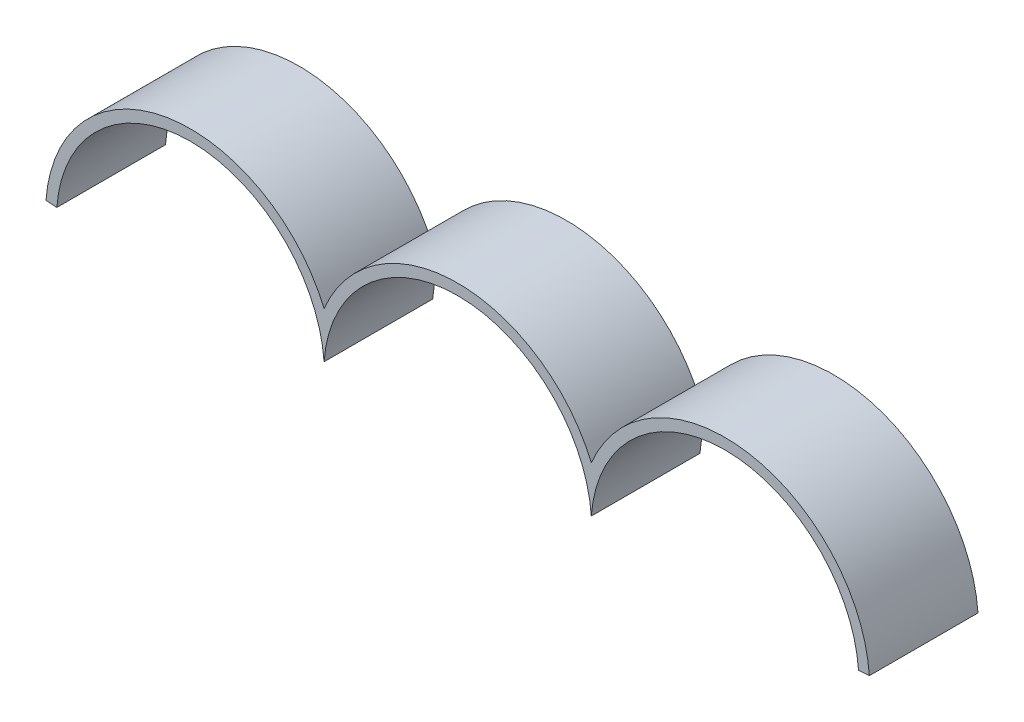
ISO-10303-21;
HEADER;
FILE_DESCRIPTION(('STEP AP214'),'2;1');
FILE_NAME('part.step','',(''),(''),'','','');
FILE_SCHEMA(('AUTOMOTIVE_DESIGN { 1 0 10303 214 1 1 1 1 }'));
ENDSEC;
DATA;
#1=APPLICATION_CONTEXT('core data for automotive mechanical design processes');
#2=APPLICATION_PROTOCOL_DEFINITION('international standard','automotive_design',2000,#1);
#3=PRODUCT_CONTEXT('',#1,'mechanical');
#4=PRODUCT('Part','Part','',(#3));
#5=PRODUCT_RELATED_PRODUCT_CATEGORY('part','',(#4));
#6=PRODUCT_DEFINITION_FORMATION('','',#4);
#7=PRODUCT_DEFINITION_CONTEXT('part definition',#1,'design');
#8=PRODUCT_DEFINITION('design','',#6,#7);
#9=PRODUCT_DEFINITION_SHAPE('','',#8);
#10=(LENGTH_UNIT() NAMED_UNIT(*) SI_UNIT(.MILLI.,.METRE.));
#11=(NAMED_UNIT(*) PLANE_ANGLE_UNIT() SI_UNIT($,.RADIAN.));
#12=(NAMED_UNIT(*) SI_UNIT($,.STERADIAN.) SOLID_ANGLE_UNIT());
#13=UNCERTAINTY_MEASURE_WITH_UNIT(LENGTH_MEASURE(1.E-05),#10,'distance_accuracy_value','');
#14=(GEOMETRIC_REPRESENTATION_CONTEXT(3) GLOBAL_UNCERTAINTY_ASSIGNED_CONTEXT((#13)) GLOBAL_UNIT_ASSIGNED_CONTEXT((#10,
#11,#12)) REPRESENTATION_CONTEXT('',''));
#15=CARTESIAN_POINT('',(0.,0.,0.));
#16=DIRECTION('',(0.,0.,1.));
#17=DIRECTION('',(1.,0.,0.));
#18=AXIS2_PLACEMENT_3D('',#15,#16,#17);
#19=CARTESIAN_POINT('',(-36.8997698041831,-2.72157829178189,30.));
#20=DIRECTION('',(0.,0.,-1.));
#21=DIRECTION('',(-1.,0.,0.));
#22=AXIS2_PLACEMENT_3D('',#19,#20,#21);
#23=CYLINDRICAL_SURFACE('',#22,37.);
#24=CARTESIAN_POINT('',(-36.8997698041831,-2.72157829178189,0.));
#25=DIRECTION('',(0.,0.,-1.));
#26=DIRECTION('',(1.,0.,0.));
#27=AXIS2_PLACEMENT_3D('',#24,#25,#26);
#28=CIRCLE('',#27,37.);
#29=CARTESIAN_POINT('',(-73.7995396083662,0.,0.));
#30=VERTEX_POINT('',#29);
#31=CARTESIAN_POINT('',(0.,0.,0.));
#32=VERTEX_POINT('',#31);
#33=EDGE_CURVE('E128',#30,#32,#28,.T.);
#34=ORIENTED_EDGE('',*,*,#33,.T.);
#35=DIRECTION('',(0.,0.,-1.));
#36=VECTOR('',#35,1.);
#37=CARTESIAN_POINT('',(0.,0.,30.));
#38=LINE('',#37,#36);
#39=CARTESIAN_POINT('',(0.,0.,30.));
#40=VERTEX_POINT('',#39);
#41=EDGE_CURVE('E11',#40,#32,#38,.T.);
#42=ORIENTED_EDGE('',*,*,#41,.F.);
#43=CARTESIAN_POINT('',(-36.8997698041831,-2.72157829178189,30.));
#44=DIRECTION('',(0.,0.,-1.));
#45=DIRECTION('',(1.,0.,0.));
#46=AXIS2_PLACEMENT_3D('',#43,#44,#45);
#47=CIRCLE('',#46,37.);
#48=CARTESIAN_POINT('',(-73.7995396083662,0.,30.));
#49=VERTEX_POINT('',#48);
#50=EDGE_CURVE('E142',#49,#40,#47,.T.);
#51=ORIENTED_EDGE('',*,*,#50,.F.);
#52=DIRECTION('',(0.,0.,-1.));
#53=VECTOR('',#52,1.);
#54=CARTESIAN_POINT('',(-73.7995396083662,0.,30.));
#55=LINE('',#54,#53);
#56=EDGE_CURVE('E124',#49,#30,#55,.T.);
#57=ORIENTED_EDGE('',*,*,#56,.T.);
#58=EDGE_LOOP('',(#34,#42,#51,#57));
#59=FACE_BOUND('',#58,.T.);
#60=ADVANCED_FACE('F32',(#59),#23,.F.);
#61=CARTESIAN_POINT('',(36.8997698041831,-2.72157829178189,30.));
#62=DIRECTION('',(0.,0.,-1.));
#63=DIRECTION('',(-1.,0.,0.));
#64=AXIS2_PLACEMENT_3D('',#61,#62,#63);
#65=CYLINDRICAL_SURFACE('',#64,37.);
#66=CARTESIAN_POINT('',(36.8997698041831,-2.72157829178189,0.));
#67=DIRECTION('',(0.,0.,-1.));
#68=DIRECTION('',(-1.,0.,0.));
#69=AXIS2_PLACEMENT_3D('',#66,#67,#68);
#70=CIRCLE('',#69,37.);
#71=CARTESIAN_POINT('',(73.7995396083662,0.,0.));
#72=VERTEX_POINT('',#71);
#73=EDGE_CURVE('E131',#32,#72,#70,.T.);
#74=ORIENTED_EDGE('',*,*,#73,.T.);
#75=DIRECTION('',(0.,0.,-1.));
#76=VECTOR('',#75,1.);
#77=CARTESIAN_POINT('',(73.7995396083662,0.,30.));
#78=LINE('',#77,#76);
#79=CARTESIAN_POINT('',(73.7995396083662,0.,30.));
#80=VERTEX_POINT('',#79);
#81=EDGE_CURVE('E40',#80,#72,#78,.T.);
#82=ORIENTED_EDGE('',*,*,#81,.F.);
#83=CARTESIAN_POINT('',(36.8997698041831,-2.72157829178189,30.));
#84=DIRECTION('',(0.,0.,-1.));
#85=DIRECTION('',(-1.,0.,0.));
#86=AXIS2_PLACEMENT_3D('',#83,#84,#85);
#87=CIRCLE('',#86,37.);
#88=EDGE_CURVE('E91',#40,#80,#87,.T.);
#89=ORIENTED_EDGE('',*,*,#88,.F.);
#90=ORIENTED_EDGE('',*,*,#41,.T.);
#91=EDGE_LOOP('',(#74,#82,#89,#90));
#92=FACE_BOUND('',#91,.T.);
#93=ADVANCED_FACE('F177',(#92),#65,.F.);
#94=CARTESIAN_POINT('',(110.699309412549,-2.72157829178189,30.));
#95=DIRECTION('',(0.,0.,-1.));
#96=DIRECTION('',(-1.,0.,0.));
#97=AXIS2_PLACEMENT_3D('',#94,#95,#96);
#98=CYLINDRICAL_SURFACE('',#97,37.);
#99=CARTESIAN_POINT('',(110.699309412549,-2.72157829178189,0.));
#100=DIRECTION('',(0.,0.,-1.));
#101=DIRECTION('',(-1.,0.,0.));
#102=AXIS2_PLACEMENT_3D('',#99,#100,#101);
#103=CIRCLE('',#102,37.);
#104=CARTESIAN_POINT('',(147.599079216732,0.,0.));
#105=VERTEX_POINT('',#104);
#106=EDGE_CURVE('E133',#72,#105,#103,.T.);
#107=ORIENTED_EDGE('',*,*,#106,.T.);
#108=DIRECTION('',(0.,0.,-1.));
#109=VECTOR('',#108,1.);
#110=CARTESIAN_POINT('',(147.599079216732,0.,30.));
#111=LINE('',#110,#109);
#112=CARTESIAN_POINT('',(147.599079216732,0.,30.));
#113=VERTEX_POINT('',#112);
#114=EDGE_CURVE('E149',#113,#105,#111,.T.);
#115=ORIENTED_EDGE('',*,*,#114,.F.);
#116=CARTESIAN_POINT('',(110.699309412549,-2.72157829178189,30.));
#117=DIRECTION('',(0.,0.,-1.));
#118=DIRECTION('',(-1.,0.,0.));
#119=AXIS2_PLACEMENT_3D('',#116,#117,#118);
#120=CIRCLE('',#119,37.);
#121=EDGE_CURVE('E157',#80,#113,#120,.T.);
#122=ORIENTED_EDGE('',*,*,#121,.F.);
#123=ORIENTED_EDGE('',*,*,#81,.T.);
#124=EDGE_LOOP('',(#107,#115,#122,#123));
#125=FACE_BOUND('',#124,.T.);
#126=ADVANCED_FACE('F155',(#125),#98,.F.);
#127=CARTESIAN_POINT('',(150.590952444099,0.220668510144477,30.));
#128=DIRECTION('',(-0.0735561700481586,0.997291075788732,0.));
#129=DIRECTION('',(-0.997291075788732,-0.0735561700481586,0.));
#130=AXIS2_PLACEMENT_3D('',#127,#128,#129);
#131=PLANE('',#130);
#132=DIRECTION('',(0.997291075788732,0.0735561700481586,0.));
#133=VECTOR('',#132,1.);
#134=CARTESIAN_POINT('',(150.590952444099,0.220668510144477,0.));
#135=LINE('',#134,#133);
#136=CARTESIAN_POINT('',(150.590952444099,0.220668510144477,0.));
#137=VERTEX_POINT('',#136);
#138=EDGE_CURVE('E135',#105,#137,#135,.T.);
#139=ORIENTED_EDGE('',*,*,#138,.T.);
#140=DIRECTION('',(0.,0.,-1.));
#141=VECTOR('',#140,1.);
#142=CARTESIAN_POINT('',(150.590952444099,0.220668510144477,30.));
#143=LINE('',#142,#141);
#144=CARTESIAN_POINT('',(150.590952444099,0.220668510144477,30.));
#145=VERTEX_POINT('',#144);
#146=EDGE_CURVE('E146',#145,#137,#143,.T.);
#147=ORIENTED_EDGE('',*,*,#146,.F.);
#148=DIRECTION('',(0.997291075788732,0.0735561700481586,0.));
#149=VECTOR('',#148,1.);
#150=CARTESIAN_POINT('',(150.590952444099,0.220668510144477,30.));
#151=LINE('',#150,#149);
#152=EDGE_CURVE('E169',#113,#145,#151,.T.);
#153=ORIENTED_EDGE('',*,*,#152,.F.);
#154=ORIENTED_EDGE('',*,*,#114,.T.);
#155=EDGE_LOOP('',(#139,#147,#153,#154));
#156=FACE_BOUND('',#155,.T.);
#157=ADVANCED_FACE('F165',(#156),#131,.F.);
#158=CARTESIAN_POINT('',(110.699309412549,-2.72157829178189,30.));
#159=DIRECTION('',(0.,0.,-1.));
#160=DIRECTION('',(-1.,0.,0.));
#161=AXIS2_PLACEMENT_3D('',#158,#159,#160);
#162=CYLINDRICAL_SURFACE('',#161,40.);
#163=CARTESIAN_POINT('',(110.699309412549,-2.72157829178189,0.));
#164=DIRECTION('',(0.,0.,1.));
#165=DIRECTION('',(-1.,0.,0.));
#166=AXIS2_PLACEMENT_3D('',#163,#164,#165);
#167=CIRCLE('',#166,40.);
#168=CARTESIAN_POINT('',(73.7995396083662,12.718855264252,0.));
#169=VERTEX_POINT('',#168);
#170=EDGE_CURVE('E137',#137,#169,#167,.T.);
#171=ORIENTED_EDGE('',*,*,#170,.T.);
#172=DIRECTION('',(0.,0.,-1.));
#173=VECTOR('',#172,1.);
#174=CARTESIAN_POINT('',(73.7995396083662,12.718855264252,30.));
#175=LINE('',#174,#173);
#176=CARTESIAN_POINT('',(73.7995396083662,12.718855264252,30.));
#177=VERTEX_POINT('',#176);
#178=EDGE_CURVE('E119',#177,#169,#175,.T.);
#179=ORIENTED_EDGE('',*,*,#178,.F.);
#180=CARTESIAN_POINT('',(110.699309412549,-2.72157829178189,30.));
#181=DIRECTION('',(0.,0.,1.));
#182=DIRECTION('',(-1.,0.,0.));
#183=AXIS2_PLACEMENT_3D('',#180,#181,#182);
#184=CIRCLE('',#183,40.);
#185=EDGE_CURVE('E110',#145,#177,#184,.T.);
#186=ORIENTED_EDGE('',*,*,#185,.F.);
#187=ORIENTED_EDGE('',*,*,#146,.T.);
#188=EDGE_LOOP('',(#171,#179,#186,#187));
#189=FACE_BOUND('',#188,.T.);
#190=ADVANCED_FACE('F168',(#189),#162,.T.);
#191=CARTESIAN_POINT('',(36.8997698041831,-2.72157829178189,30.));
#192=DIRECTION('',(0.,0.,-1.));
#193=DIRECTION('',(-1.,0.,0.));
#194=AXIS2_PLACEMENT_3D('',#191,#192,#193);
#195=CYLINDRICAL_SURFACE('',#194,40.);
#196=CARTESIAN_POINT('',(36.8997698041831,-2.72157829178189,0.));
#197=DIRECTION('',(0.,0.,1.));
#198=DIRECTION('',(-1.,0.,0.));
#199=AXIS2_PLACEMENT_3D('',#196,#197,#198);
#200=CIRCLE('',#199,40.);
#201=CARTESIAN_POINT('',(0.,12.718855264252,0.));
#202=VERTEX_POINT('',#201);
#203=EDGE_CURVE('E118',#169,#202,#200,.T.);
#204=ORIENTED_EDGE('',*,*,#203,.T.);
#205=DIRECTION('',(0.,0.,-1.));
#206=VECTOR('',#205,1.);
#207=CARTESIAN_POINT('',(0.,12.718855264252,30.));
#208=LINE('',#207,#206);
#209=CARTESIAN_POINT('',(0.,12.718855264252,30.));
#210=VERTEX_POINT('',#209);
#211=EDGE_CURVE('E115',#210,#202,#208,.T.);
#212=ORIENTED_EDGE('',*,*,#211,.F.);
#213=CARTESIAN_POINT('',(36.8997698041831,-2.72157829178189,30.));
#214=DIRECTION('',(0.,0.,1.));
#215=DIRECTION('',(-1.,0.,0.));
#216=AXIS2_PLACEMENT_3D('',#213,#214,#215);
#217=CIRCLE('',#216,40.);
#218=EDGE_CURVE('E104',#177,#210,#217,.T.);
#219=ORIENTED_EDGE('',*,*,#218,.F.);
#220=ORIENTED_EDGE('',*,*,#178,.T.);
#221=EDGE_LOOP('',(#204,#212,#219,#220));
#222=FACE_BOUND('',#221,.T.);
#223=ADVANCED_FACE('F116',(#222),#195,.T.);
#224=CARTESIAN_POINT('',(-36.8997698041831,-2.72157829178189,30.));
#225=DIRECTION('',(0.,0.,-1.));
#226=DIRECTION('',(-1.,0.,0.));
#227=AXIS2_PLACEMENT_3D('',#224,#225,#226);
#228=CYLINDRICAL_SURFACE('',#227,40.);
#229=CARTESIAN_POINT('',(-36.8997698041831,-2.72157829178189,0.));
#230=DIRECTION('',(0.,0.,1.));
#231=DIRECTION('',(1.,0.,0.));
#232=AXIS2_PLACEMENT_3D('',#229,#230,#231);
#233=CIRCLE('',#232,40.);
#234=CARTESIAN_POINT('',(-76.7914128357324,0.220668510144472,0.));
#235=VERTEX_POINT('',#234);
#236=EDGE_CURVE('E77',#202,#235,#233,.T.);
#237=ORIENTED_EDGE('',*,*,#236,.T.);
#238=DIRECTION('',(0.,0.,-1.));
#239=VECTOR('',#238,1.);
#240=CARTESIAN_POINT('',(-76.7914128357324,0.220668510144472,30.));
#241=LINE('',#240,#239);
#242=CARTESIAN_POINT('',(-76.7914128357324,0.220668510144472,30.));
#243=VERTEX_POINT('',#242);
#244=EDGE_CURVE('E120',#243,#235,#241,.T.);
#245=ORIENTED_EDGE('',*,*,#244,.F.);
#246=CARTESIAN_POINT('',(-36.8997698041831,-2.72157829178189,30.));
#247=DIRECTION('',(0.,0.,1.));
#248=DIRECTION('',(1.,0.,0.));
#249=AXIS2_PLACEMENT_3D('',#246,#247,#248);
#250=CIRCLE('',#249,40.);
#251=EDGE_CURVE('E108',#210,#243,#250,.T.);
#252=ORIENTED_EDGE('',*,*,#251,.F.);
#253=ORIENTED_EDGE('',*,*,#211,.T.);
#254=EDGE_LOOP('',(#237,#245,#252,#253));
#255=FACE_BOUND('',#254,.T.);
#256=ADVANCED_FACE('F122',(#255),#228,.T.);
#257=CARTESIAN_POINT('',(-76.7914128357324,0.220668510144472,30.));
#258=DIRECTION('',(0.0735561700481571,0.997291075788732,0.));
#259=DIRECTION('',(-0.997291075788732,0.0735561700481571,0.));
#260=AXIS2_PLACEMENT_3D('',#257,#258,#259);
#261=PLANE('',#260);
#262=DIRECTION('',(0.997291075788732,-0.0735561700481571,0.));
#263=VECTOR('',#262,1.);
#264=CARTESIAN_POINT('',(-76.7914128357324,0.220668510144472,0.));
#265=LINE('',#264,#263);
#266=EDGE_CURVE('E83',#235,#30,#265,.T.);
#267=ORIENTED_EDGE('',*,*,#266,.T.);
#268=ORIENTED_EDGE('',*,*,#56,.F.);
#269=DIRECTION('',(0.997291075788732,-0.0735561700481571,0.));
#270=VECTOR('',#269,1.);
#271=CARTESIAN_POINT('',(-76.7914128357324,0.220668510144472,30.));
#272=LINE('',#271,#270);
#273=EDGE_CURVE('E48',#243,#49,#272,.T.);
#274=ORIENTED_EDGE('',*,*,#273,.F.);
#275=ORIENTED_EDGE('',*,*,#244,.T.);
#276=EDGE_LOOP('',(#267,#268,#274,#275));
#277=FACE_BOUND('',#276,.T.);
#278=ADVANCED_FACE('F193',(#277),#261,.F.);
#279=CARTESIAN_POINT('',(-36.8997698041831,-2.72157829178189,30.));
#280=DIRECTION('',(0.,0.,1.));
#281=DIRECTION('',(1.,0.,0.));
#282=AXIS2_PLACEMENT_3D('',#279,#280,#281);
#283=PLANE('',#282);
#284=ORIENTED_EDGE('',*,*,#50,.T.);
#285=ORIENTED_EDGE('',*,*,#88,.T.);
#286=ORIENTED_EDGE('',*,*,#121,.T.);
#287=ORIENTED_EDGE('',*,*,#152,.T.);
#288=ORIENTED_EDGE('',*,*,#185,.T.);
#289=ORIENTED_EDGE('',*,*,#218,.T.);
#290=ORIENTED_EDGE('',*,*,#251,.T.);
#291=ORIENTED_EDGE('',*,*,#273,.T.);
#292=EDGE_LOOP('',(#284,#285,#286,#287,#288,#289,#290,#291));
#293=FACE_BOUND('',#292,.T.);
#294=ADVANCED_FACE('F106',(#293),#283,.T.);
#295=CARTESIAN_POINT('',(-36.8997698041831,-2.72157829178189,0.));
#296=DIRECTION('',(0.,0.,1.));
#297=DIRECTION('',(1.,0.,0.));
#298=AXIS2_PLACEMENT_3D('',#295,#296,#297);
#299=PLANE('',#298);
#300=ORIENTED_EDGE('',*,*,#33,.F.);
#301=ORIENTED_EDGE('',*,*,#266,.F.);
#302=ORIENTED_EDGE('',*,*,#236,.F.);
#303=ORIENTED_EDGE('',*,*,#203,.F.);
#304=ORIENTED_EDGE('',*,*,#170,.F.);
#305=ORIENTED_EDGE('',*,*,#138,.F.);
#306=ORIENTED_EDGE('',*,*,#106,.F.);
#307=ORIENTED_EDGE('',*,*,#73,.F.);
#308=EDGE_LOOP('',(#300,#301,#302,#303,#304,#305,#306,#307));
#309=FACE_BOUND('',#308,.T.);
#310=ADVANCED_FACE('F161',(#309),#299,.F.);
#311=CLOSED_SHELL('',(#60,#93,#126,#157,#190,#223,#256,#278,#294,#310));
#312=MANIFOLD_SOLID_BREP('B2',#311);
#313=ADVANCED_BREP_SHAPE_REPRESENTATION('',(#18,#312),#14);
#314=SHAPE_DEFINITION_REPRESENTATION(#9,#313);
ENDSEC;
END-ISO-10303-21;
